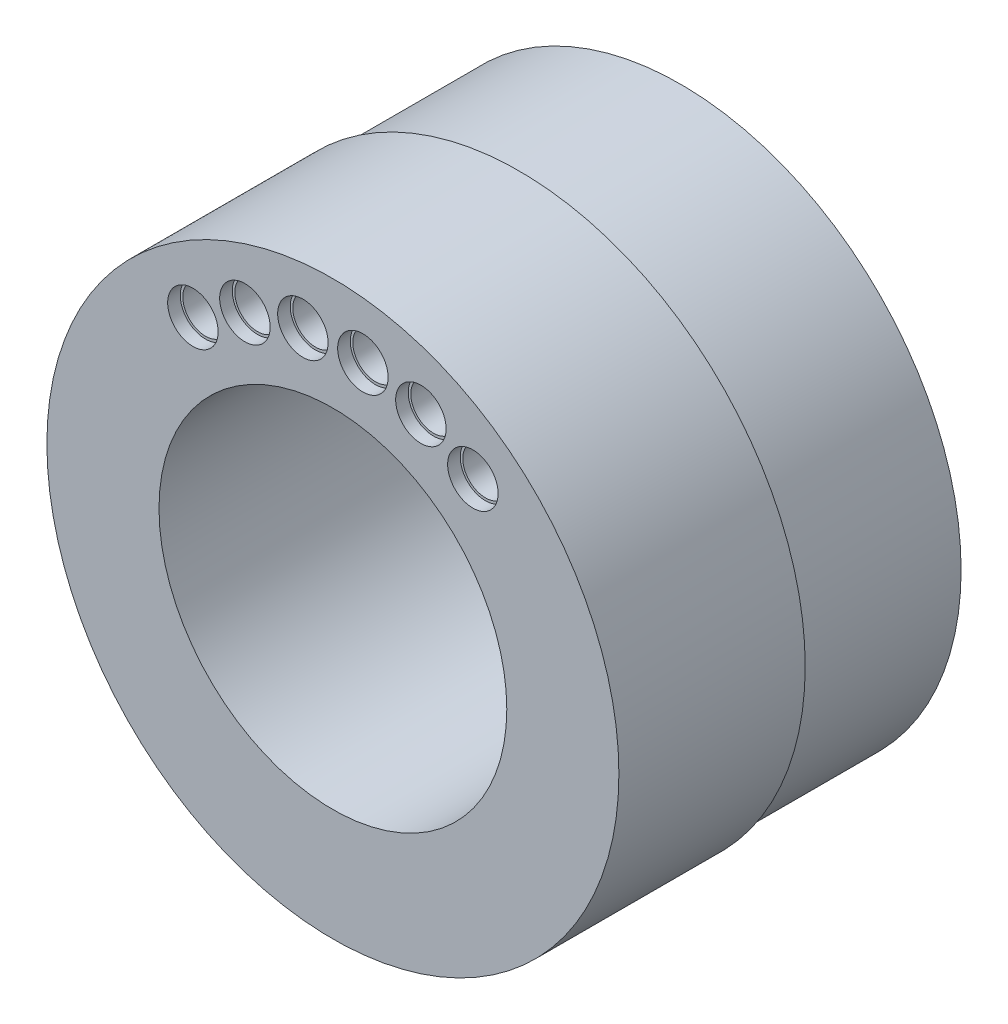
ISO-10303-21;
HEADER;
FILE_DESCRIPTION(('STEP AP214'),'2;1');
FILE_NAME('part.step','',(''),(''),'','','');
FILE_SCHEMA(('AUTOMOTIVE_DESIGN { 1 0 10303 214 1 1 1 1 }'));
ENDSEC;
DATA;
#1=APPLICATION_CONTEXT('core data for automotive mechanical design processes');
#2=APPLICATION_PROTOCOL_DEFINITION('international standard','automotive_design',2000,#1);
#3=PRODUCT_CONTEXT('',#1,'mechanical');
#4=PRODUCT('Part','Part','',(#3));
#5=PRODUCT_RELATED_PRODUCT_CATEGORY('part','',(#4));
#6=PRODUCT_DEFINITION_FORMATION('','',#4);
#7=PRODUCT_DEFINITION_CONTEXT('part definition',#1,'design');
#8=PRODUCT_DEFINITION('design','',#6,#7);
#9=PRODUCT_DEFINITION_SHAPE('','',#8);
#10=(LENGTH_UNIT() NAMED_UNIT(*) SI_UNIT(.MILLI.,.METRE.));
#11=(NAMED_UNIT(*) PLANE_ANGLE_UNIT() SI_UNIT($,.RADIAN.));
#12=(NAMED_UNIT(*) SI_UNIT($,.STERADIAN.) SOLID_ANGLE_UNIT());
#13=UNCERTAINTY_MEASURE_WITH_UNIT(LENGTH_MEASURE(1.E-05),#10,'distance_accuracy_value','');
#14=(GEOMETRIC_REPRESENTATION_CONTEXT(3) GLOBAL_UNCERTAINTY_ASSIGNED_CONTEXT((#13)) GLOBAL_UNIT_ASSIGNED_CONTEXT((#10,
#11,#12)) REPRESENTATION_CONTEXT('',''));
#15=CARTESIAN_POINT('',(0.,0.,0.));
#16=DIRECTION('',(0.,0.,1.));
#17=DIRECTION('',(1.,0.,0.));
#18=AXIS2_PLACEMENT_3D('',#15,#16,#17);
#19=CARTESIAN_POINT('',(23.025,0.,13.));
#20=DIRECTION('',(0.,0.,-1.));
#21=DIRECTION('',(-1.,0.,0.));
#22=AXIS2_PLACEMENT_3D('',#19,#20,#21);
#23=PLANE('',#22);
#24=CARTESIAN_POINT('',(0.,0.,13.));
#25=DIRECTION('',(0.,0.,1.));
#26=DIRECTION('',(1.,0.,0.));
#27=AXIS2_PLACEMENT_3D('',#24,#25,#26);
#28=CIRCLE('',#27,23.025);
#29=CARTESIAN_POINT('',(23.025,0.,13.));
#30=VERTEX_POINT('',#29);
#31=EDGE_CURVE('E11',#30,#30,#28,.T.);
#32=ORIENTED_EDGE('',*,*,#31,.F.);
#33=EDGE_LOOP('',(#32));
#34=FACE_BOUND('',#33,.T.);
#35=CARTESIAN_POINT('',(0.,0.,13.));
#36=DIRECTION('',(0.,0.,-1.));
#37=DIRECTION('',(-1.,0.,0.));
#38=AXIS2_PLACEMENT_3D('',#35,#36,#37);
#39=CIRCLE('',#38,22.575);
#40=CARTESIAN_POINT('',(22.575,0.,13.));
#41=VERTEX_POINT('',#40);
#42=EDGE_CURVE('E105',#41,#41,#39,.T.);
#43=ORIENTED_EDGE('',*,*,#42,.F.);
#44=EDGE_LOOP('',(#43));
#45=FACE_BOUND('',#44,.T.);
#46=ADVANCED_FACE('F35',(#34,#45),#23,.T.);
#47=CARTESIAN_POINT('',(0.,0.,13.));
#48=DIRECTION('',(0.,0.,1.));
#49=DIRECTION('',(1.,0.,0.));
#50=AXIS2_PLACEMENT_3D('',#47,#48,#49);
#51=CYLINDRICAL_SURFACE('',#50,23.025);
#52=ORIENTED_EDGE('',*,*,#31,.T.);
#53=EDGE_LOOP('',(#52));
#54=FACE_BOUND('',#53,.T.);
#55=CARTESIAN_POINT('',(0.,0.,28.));
#56=DIRECTION('',(0.,0.,1.));
#57=DIRECTION('',(1.,0.,0.));
#58=AXIS2_PLACEMENT_3D('',#55,#56,#57);
#59=CIRCLE('',#58,23.025);
#60=CARTESIAN_POINT('',(23.025,0.,28.));
#61=VERTEX_POINT('',#60);
#62=EDGE_CURVE('E44',#61,#61,#59,.T.);
#63=ORIENTED_EDGE('',*,*,#62,.F.);
#64=EDGE_LOOP('',(#63));
#65=FACE_BOUND('',#64,.T.);
#66=ADVANCED_FACE('F37',(#54,#65),#51,.T.);
#67=CARTESIAN_POINT('',(0.,0.,28.));
#68=DIRECTION('',(0.,0.,1.));
#69=DIRECTION('',(1.,0.,0.));
#70=AXIS2_PLACEMENT_3D('',#67,#68,#69);
#71=PLANE('',#70);
#72=CARTESIAN_POINT('',(11.2696959545239,14.6869537121415,28.));
#73=DIRECTION('',(0.,0.,1.));
#74=DIRECTION('',(1.,0.,0.));
#75=AXIS2_PLACEMENT_3D('',#72,#73,#74);
#76=CIRCLE('',#75,2.032);
#77=CARTESIAN_POINT('',(13.3016959545239,14.6869537121415,28.));
#78=VERTEX_POINT('',#77);
#79=EDGE_CURVE('E148',#78,#78,#76,.T.);
#80=ORIENTED_EDGE('',*,*,#79,.F.);
#81=EDGE_LOOP('',(#80));
#82=FACE_BOUND('',#81,.T.);
#83=CARTESIAN_POINT('',(7.08442704165876,17.1033198456152,28.));
#84=DIRECTION('',(0.,0.,1.));
#85=DIRECTION('',(1.,0.,0.));
#86=AXIS2_PLACEMENT_3D('',#83,#84,#85);
#87=CIRCLE('',#86,2.032);
#88=CARTESIAN_POINT('',(9.11642704165876,17.1033198456152,28.));
#89=VERTEX_POINT('',#88);
#90=EDGE_CURVE('E141',#89,#89,#87,.T.);
#91=ORIENTED_EDGE('',*,*,#90,.F.);
#92=EDGE_LOOP('',(#91));
#93=FACE_BOUND('',#92,.T.);
#94=CARTESIAN_POINT('',(2.41636613347372,18.3541229961827,28.));
#95=DIRECTION('',(0.,0.,1.));
#96=DIRECTION('',(1.,0.,0.));
#97=AXIS2_PLACEMENT_3D('',#94,#95,#96);
#98=CIRCLE('',#97,2.032);
#99=CARTESIAN_POINT('',(4.44836613347372,18.3541229961827,28.));
#100=VERTEX_POINT('',#99);
#101=EDGE_CURVE('E134',#100,#100,#98,.T.);
#102=ORIENTED_EDGE('',*,*,#101,.F.);
#103=EDGE_LOOP('',(#102));
#104=FACE_BOUND('',#103,.T.);
#105=CARTESIAN_POINT('',(-2.41636613347372,18.3541229961827,28.));
#106=DIRECTION('',(0.,0.,1.));
#107=DIRECTION('',(1.,0.,0.));
#108=AXIS2_PLACEMENT_3D('',#105,#106,#107);
#109=CIRCLE('',#108,2.032);
#110=CARTESIAN_POINT('',(-0.384366133473724,18.3541229961827,28.));
#111=VERTEX_POINT('',#110);
#112=EDGE_CURVE('E130',#111,#111,#109,.T.);
#113=ORIENTED_EDGE('',*,*,#112,.F.);
#114=EDGE_LOOP('',(#113));
#115=FACE_BOUND('',#114,.T.);
#116=CARTESIAN_POINT('',(-7.08442704165876,17.1033198456152,28.));
#117=DIRECTION('',(0.,0.,1.));
#118=DIRECTION('',(1.,0.,0.));
#119=AXIS2_PLACEMENT_3D('',#116,#117,#118);
#120=CIRCLE('',#119,2.032);
#121=CARTESIAN_POINT('',(-5.05242704165876,17.1033198456152,28.));
#122=VERTEX_POINT('',#121);
#123=EDGE_CURVE('E126',#122,#122,#120,.T.);
#124=ORIENTED_EDGE('',*,*,#123,.F.);
#125=EDGE_LOOP('',(#124));
#126=FACE_BOUND('',#125,.T.);
#127=CARTESIAN_POINT('',(-11.2696959545239,14.6869537121415,28.));
#128=DIRECTION('',(0.,0.,1.));
#129=DIRECTION('',(1.,0.,0.));
#130=AXIS2_PLACEMENT_3D('',#127,#128,#129);
#131=CIRCLE('',#130,2.032);
#132=CARTESIAN_POINT('',(-9.23769595452388,14.6869537121415,28.));
#133=VERTEX_POINT('',#132);
#134=EDGE_CURVE('E121',#133,#133,#131,.T.);
#135=ORIENTED_EDGE('',*,*,#134,.F.);
#136=EDGE_LOOP('',(#135));
#137=FACE_BOUND('',#136,.T.);
#138=CARTESIAN_POINT('',(0.,0.,28.));
#139=DIRECTION('',(0.,0.,1.));
#140=DIRECTION('',(1.,0.,0.));
#141=AXIS2_PLACEMENT_3D('',#138,#139,#140);
#142=CIRCLE('',#141,14.);
#143=CARTESIAN_POINT('',(14.,0.,28.));
#144=VERTEX_POINT('',#143);
#145=EDGE_CURVE('E93',#144,#144,#142,.T.);
#146=ORIENTED_EDGE('',*,*,#145,.F.);
#147=EDGE_LOOP('',(#146));
#148=FACE_BOUND('',#147,.T.);
#149=ORIENTED_EDGE('',*,*,#62,.T.);
#150=EDGE_LOOP('',(#149));
#151=FACE_BOUND('',#150,.T.);
#152=ADVANCED_FACE('F211',(#82,#93,#104,#115,#126,#137,#148,#151),#71,.T.);
#153=CARTESIAN_POINT('',(0.,0.,0.));
#154=DIRECTION('',(0.,0.,1.));
#155=DIRECTION('',(1.,0.,0.));
#156=AXIS2_PLACEMENT_3D('',#153,#154,#155);
#157=CYLINDRICAL_SURFACE('',#156,22.575);
#158=CARTESIAN_POINT('',(0.,0.,0.));
#159=DIRECTION('',(0.,0.,-1.));
#160=DIRECTION('',(-1.,0.,0.));
#161=AXIS2_PLACEMENT_3D('',#158,#159,#160);
#162=CIRCLE('',#161,22.575);
#163=CARTESIAN_POINT('',(22.575,0.,0.));
#164=VERTEX_POINT('',#163);
#165=EDGE_CURVE('E106',#164,#164,#162,.T.);
#166=CARTESIAN_POINT('',(22.575,0.,0.));
#167=CARTESIAN_POINT('',(22.575,0.,0.135416666666667));
#168=CARTESIAN_POINT('',(22.575,0.,0.270833333333333));
#169=CARTESIAN_POINT('',(22.575,0.,0.541666666666667));
#170=CARTESIAN_POINT('',(22.575,0.,0.677083333333334));
#171=CARTESIAN_POINT('',(22.575,0.,0.947916666666667));
#172=CARTESIAN_POINT('',(22.575,0.,1.08333333333333));
#173=CARTESIAN_POINT('',(22.575,0.,1.35416666666667));
#174=CARTESIAN_POINT('',(22.575,0.,1.48958333333333));
#175=CARTESIAN_POINT('',(22.575,0.,1.76041666666667));
#176=CARTESIAN_POINT('',(22.575,0.,1.89583333333333));
#177=CARTESIAN_POINT('',(22.575,0.,2.16666666666667));
#178=CARTESIAN_POINT('',(22.575,0.,2.30208333333333));
#179=CARTESIAN_POINT('',(22.575,0.,2.57291666666667));
#180=CARTESIAN_POINT('',(22.575,0.,2.70833333333333));
#181=CARTESIAN_POINT('',(22.575,0.,2.97916666666667));
#182=CARTESIAN_POINT('',(22.575,0.,3.11458333333333));
#183=CARTESIAN_POINT('',(22.575,0.,3.38541666666667));
#184=CARTESIAN_POINT('',(22.575,0.,3.52083333333333));
#185=CARTESIAN_POINT('',(22.575,0.,3.79166666666667));
#186=CARTESIAN_POINT('',(22.575,0.,3.92708333333334));
#187=CARTESIAN_POINT('',(22.575,0.,4.19791666666667));
#188=CARTESIAN_POINT('',(22.575,0.,4.33333333333334));
#189=CARTESIAN_POINT('',(22.575,0.,4.60416666666667));
#190=CARTESIAN_POINT('',(22.575,0.,4.73958333333333));
#191=CARTESIAN_POINT('',(22.575,0.,5.01041666666667));
#192=CARTESIAN_POINT('',(22.575,0.,5.14583333333334));
#193=CARTESIAN_POINT('',(22.575,0.,5.41666666666667));
#194=CARTESIAN_POINT('',(22.575,0.,5.55208333333334));
#195=CARTESIAN_POINT('',(22.575,0.,5.82291666666667));
#196=CARTESIAN_POINT('',(22.575,0.,5.95833333333334));
#197=CARTESIAN_POINT('',(22.575,0.,6.22916666666667));
#198=CARTESIAN_POINT('',(22.575,0.,6.36458333333334));
#199=CARTESIAN_POINT('',(22.575,0.,6.63541666666667));
#200=CARTESIAN_POINT('',(22.575,0.,6.77083333333334));
#201=CARTESIAN_POINT('',(22.575,0.,7.04166666666667));
#202=CARTESIAN_POINT('',(22.575,0.,7.17708333333334));
#203=CARTESIAN_POINT('',(22.575,0.,7.44791666666667));
#204=CARTESIAN_POINT('',(22.575,0.,7.58333333333334));
#205=CARTESIAN_POINT('',(22.575,0.,7.85416666666667));
#206=CARTESIAN_POINT('',(22.575,0.,7.98958333333334));
#207=CARTESIAN_POINT('',(22.575,0.,8.26041666666667));
#208=CARTESIAN_POINT('',(22.575,0.,8.39583333333334));
#209=CARTESIAN_POINT('',(22.575,0.,8.66666666666667));
#210=CARTESIAN_POINT('',(22.575,0.,8.80208333333334));
#211=CARTESIAN_POINT('',(22.575,0.,9.07291666666667));
#212=CARTESIAN_POINT('',(22.575,0.,9.20833333333334));
#213=CARTESIAN_POINT('',(22.575,0.,9.47916666666667));
#214=CARTESIAN_POINT('',(22.575,0.,9.61458333333334));
#215=CARTESIAN_POINT('',(22.575,0.,9.88541666666667));
#216=CARTESIAN_POINT('',(22.575,0.,10.0208333333333));
#217=CARTESIAN_POINT('',(22.575,0.,10.2916666666667));
#218=CARTESIAN_POINT('',(22.575,0.,10.4270833333333));
#219=CARTESIAN_POINT('',(22.575,0.,10.6979166666667));
#220=CARTESIAN_POINT('',(22.575,0.,10.8333333333333));
#221=CARTESIAN_POINT('',(22.575,0.,11.1041666666667));
#222=CARTESIAN_POINT('',(22.575,0.,11.2395833333333));
#223=CARTESIAN_POINT('',(22.575,0.,11.5104166666667));
#224=CARTESIAN_POINT('',(22.575,0.,11.6458333333333));
#225=CARTESIAN_POINT('',(22.575,0.,11.9166666666667));
#226=CARTESIAN_POINT('',(22.575,0.,12.0520833333333));
#227=CARTESIAN_POINT('',(22.575,0.,12.3229166666667));
#228=CARTESIAN_POINT('',(22.575,0.,12.4583333333333));
#229=CARTESIAN_POINT('',(22.575,0.,12.7291666666667));
#230=CARTESIAN_POINT('',(22.575,0.,12.8645833333333));
#231=CARTESIAN_POINT('',(22.575,0.,13.));
#232=B_SPLINE_CURVE_WITH_KNOTS('',3,(#166,#167,#168,#169,#170,#171,#172,#173,#174,#175,#176,
#177,#178,#179,#180,#181,#182,#183,#184,#185,#186,#187,#188,#189,#190,#191,#192,#193,#194,#195,
#196,#197,#198,#199,#200,#201,#202,#203,#204,#205,#206,#207,#208,#209,#210,#211,#212,#213,#214,
#215,#216,#217,#218,#219,#220,#221,#222,#223,#224,#225,#226,#227,#228,#229,#230,#231),
.UNSPECIFIED.,.F.,.F.,(4,2,2,2,2,2,2,2,2,2,2,2,2,2,2,2,2,2,2,2,2,2,2,2,2,2,2,2,2,2,2,2,4),(0.,
0.40625,0.8125,1.21875,1.625,2.03125,2.4375,2.84375,3.25,3.65625,4.0625,4.46875,4.875,5.28125,
5.6875,6.09375,6.5,6.90625,7.3125,7.71875,8.125,8.53125,8.93750000000001,9.34375000000001,9.75,
10.15625,10.5625,10.96875,11.375,11.78125,12.1875,12.59375,13.),.UNSPECIFIED.);
#233=EDGE_CURVE('BSEAM218',#164,#41,#232,.T.);
#234=ORIENTED_EDGE('',*,*,#165,.F.);
#235=ORIENTED_EDGE('',*,*,#42,.T.);
#236=ORIENTED_EDGE('',*,*,#233,.T.);
#237=ORIENTED_EDGE('',*,*,#233,.F.);
#238=EDGE_LOOP('',(#234,#236,#235,#237));
#239=FACE_BOUND('',#238,.T.);
#240=ADVANCED_FACE('F218',(#239),#157,.T.);
#241=CARTESIAN_POINT('',(0.,0.,0.));
#242=DIRECTION('',(0.,0.,-1.));
#243=DIRECTION('',(-1.,0.,0.));
#244=AXIS2_PLACEMENT_3D('',#241,#242,#243);
#245=PLANE('',#244);
#246=CARTESIAN_POINT('',(0.,17.5,0.));
#247=DIRECTION('',(0.,0.,-1.));
#248=DIRECTION('',(-1.,0.,0.));
#249=AXIS2_PLACEMENT_3D('',#246,#247,#248);
#250=CIRCLE('',#249,1.22949999999999);
#251=CARTESIAN_POINT('',(-1.22949999999999,17.5,0.));
#252=VERTEX_POINT('',#251);
#253=EDGE_CURVE('E69',#252,#252,#250,.T.);
#254=ORIENTED_EDGE('',*,*,#253,.F.);
#255=EDGE_LOOP('',(#254));
#256=FACE_BOUND('',#255,.T.);
#257=CARTESIAN_POINT('',(17.5,0.,0.));
#258=DIRECTION('',(0.,0.,-1.));
#259=DIRECTION('',(-1.,0.,0.));
#260=AXIS2_PLACEMENT_3D('',#257,#258,#259);
#261=CIRCLE('',#260,1.22949999999999);
#262=CARTESIAN_POINT('',(16.2705,0.,0.));
#263=VERTEX_POINT('',#262);
#264=EDGE_CURVE('E68',#263,#263,#261,.T.);
#265=ORIENTED_EDGE('',*,*,#264,.F.);
#266=EDGE_LOOP('',(#265));
#267=FACE_BOUND('',#266,.T.);
#268=CARTESIAN_POINT('',(0.,-17.5,0.));
#269=DIRECTION('',(0.,0.,-1.));
#270=DIRECTION('',(-1.,0.,0.));
#271=AXIS2_PLACEMENT_3D('',#268,#269,#270);
#272=CIRCLE('',#271,1.22949999999999);
#273=CARTESIAN_POINT('',(-1.22949999999999,-17.5,0.));
#274=VERTEX_POINT('',#273);
#275=EDGE_CURVE('E81',#274,#274,#272,.T.);
#276=ORIENTED_EDGE('',*,*,#275,.F.);
#277=EDGE_LOOP('',(#276));
#278=FACE_BOUND('',#277,.T.);
#279=CARTESIAN_POINT('',(-17.5,0.,0.));
#280=DIRECTION('',(0.,0.,-1.));
#281=DIRECTION('',(-1.,0.,0.));
#282=AXIS2_PLACEMENT_3D('',#279,#280,#281);
#283=CIRCLE('',#282,1.22949999999999);
#284=CARTESIAN_POINT('',(-18.7295,0.,0.));
#285=VERTEX_POINT('',#284);
#286=EDGE_CURVE('E87',#285,#285,#283,.T.);
#287=ORIENTED_EDGE('',*,*,#286,.F.);
#288=EDGE_LOOP('',(#287));
#289=FACE_BOUND('',#288,.T.);
#290=CARTESIAN_POINT('',(0.,0.,0.));
#291=DIRECTION('',(0.,0.,1.));
#292=DIRECTION('',(1.,0.,0.));
#293=AXIS2_PLACEMENT_3D('',#290,#291,#292);
#294=CIRCLE('',#293,10.);
#295=CARTESIAN_POINT('',(10.,0.,0.));
#296=VERTEX_POINT('',#295);
#297=EDGE_CURVE('E102',#296,#296,#294,.T.);
#298=ORIENTED_EDGE('',*,*,#297,.T.);
#299=EDGE_LOOP('',(#298));
#300=FACE_BOUND('',#299,.T.);
#301=ORIENTED_EDGE('',*,*,#165,.T.);
#302=EDGE_LOOP('',(#301));
#303=FACE_BOUND('',#302,.T.);
#304=ADVANCED_FACE('F222',(#256,#267,#278,#289,#300,#303),#245,.T.);
#305=CARTESIAN_POINT('',(0.,0.,28.));
#306=DIRECTION('',(0.,0.,1.));
#307=DIRECTION('',(1.,0.,0.));
#308=AXIS2_PLACEMENT_3D('',#305,#306,#307);
#309=CYLINDRICAL_SURFACE('',#308,10.);
#310=ORIENTED_EDGE('',*,*,#297,.F.);
#311=EDGE_LOOP('',(#310));
#312=FACE_BOUND('',#311,.T.);
#313=CARTESIAN_POINT('',(0.,0.,0.999999999999997));
#314=DIRECTION('',(0.,0.,1.));
#315=DIRECTION('',(1.,0.,0.));
#316=AXIS2_PLACEMENT_3D('',#313,#314,#315);
#317=CIRCLE('',#316,10.);
#318=CARTESIAN_POINT('',(10.,0.,0.999999999999997));
#319=VERTEX_POINT('',#318);
#320=EDGE_CURVE('E99',#319,#319,#317,.T.);
#321=ORIENTED_EDGE('',*,*,#320,.T.);
#322=EDGE_LOOP('',(#321));
#323=FACE_BOUND('',#322,.T.);
#324=ADVANCED_FACE('F226',(#312,#323),#309,.F.);
#325=CARTESIAN_POINT('',(10.,0.,0.999999999999999));
#326=DIRECTION('',(0.,0.,-1.));
#327=DIRECTION('',(-1.,0.,0.));
#328=AXIS2_PLACEMENT_3D('',#325,#326,#327);
#329=PLANE('',#328);
#330=ORIENTED_EDGE('',*,*,#320,.F.);
#331=EDGE_LOOP('',(#330));
#332=FACE_BOUND('',#331,.T.);
#333=CARTESIAN_POINT('',(0.,0.,1.));
#334=DIRECTION('',(0.,0.,1.));
#335=DIRECTION('',(1.,0.,0.));
#336=AXIS2_PLACEMENT_3D('',#333,#334,#335);
#337=CIRCLE('',#336,14.);
#338=CARTESIAN_POINT('',(14.,0.,1.));
#339=VERTEX_POINT('',#338);
#340=EDGE_CURVE('E96',#339,#339,#337,.T.);
#341=ORIENTED_EDGE('',*,*,#340,.T.);
#342=EDGE_LOOP('',(#341));
#343=FACE_BOUND('',#342,.T.);
#344=ADVANCED_FACE('F230',(#332,#343),#329,.F.);
#345=CARTESIAN_POINT('',(0.,0.,28.));
#346=DIRECTION('',(0.,0.,1.));
#347=DIRECTION('',(1.,0.,0.));
#348=AXIS2_PLACEMENT_3D('',#345,#346,#347);
#349=CYLINDRICAL_SURFACE('',#348,14.);
#350=ORIENTED_EDGE('',*,*,#340,.F.);
#351=EDGE_LOOP('',(#350));
#352=FACE_BOUND('',#351,.T.);
#353=ORIENTED_EDGE('',*,*,#145,.T.);
#354=EDGE_LOOP('',(#353));
#355=FACE_BOUND('',#354,.T.);
#356=ADVANCED_FACE('F234',(#352,#355),#349,.F.);
#357=CARTESIAN_POINT('',(-17.5,0.,14.9999999992766));
#358=DIRECTION('',(0.,0.,-1.));
#359=DIRECTION('',(-1.,0.,0.));
#360=AXIS2_PLACEMENT_3D('',#357,#358,#359);
#361=CONICAL_SURFACE('',#360,1.22949999999999,1.02974425749999);
#362=CARTESIAN_POINT('',(-17.5,0.,15.73875813234));
#363=VERTEX_POINT('',#362);
#364=VERTEX_LOOP('',#363);
#365=FACE_BOUND('',#364,.T.);
#366=CARTESIAN_POINT('',(-17.5,0.,14.9999999992766));
#367=DIRECTION('',(0.,0.,-1.));
#368=DIRECTION('',(-1.,0.,0.));
#369=AXIS2_PLACEMENT_3D('',#366,#367,#368);
#370=CIRCLE('',#369,1.22949999999999);
#371=CARTESIAN_POINT('',(-18.7295,0.,14.9999999992766));
#372=VERTEX_POINT('',#371);
#373=EDGE_CURVE('E90',#372,#372,#370,.T.);
#374=ORIENTED_EDGE('',*,*,#373,.T.);
#375=EDGE_LOOP('',(#374));
#376=FACE_BOUND('',#375,.T.);
#377=ADVANCED_FACE('F238',(#365,#376),#361,.F.);
#378=CARTESIAN_POINT('',(-17.5,0.,0.));
#379=DIRECTION('',(0.,0.,-1.));
#380=DIRECTION('',(-1.,0.,0.));
#381=AXIS2_PLACEMENT_3D('',#378,#379,#380);
#382=CYLINDRICAL_SURFACE('',#381,1.22949999999999);
#383=ORIENTED_EDGE('',*,*,#373,.F.);
#384=EDGE_LOOP('',(#383));
#385=FACE_BOUND('',#384,.T.);
#386=ORIENTED_EDGE('',*,*,#286,.T.);
#387=EDGE_LOOP('',(#386));
#388=FACE_BOUND('',#387,.T.);
#389=ADVANCED_FACE('F242',(#385,#388),#382,.F.);
#390=CARTESIAN_POINT('',(0.,-17.5,14.9999999992766));
#391=DIRECTION('',(0.,0.,-1.));
#392=DIRECTION('',(-1.,0.,0.));
#393=AXIS2_PLACEMENT_3D('',#390,#391,#392);
#394=CONICAL_SURFACE('',#393,1.22949999999999,1.02974425749999);
#395=CARTESIAN_POINT('',(0.,-17.5,15.73875813234));
#396=VERTEX_POINT('',#395);
#397=VERTEX_LOOP('',#396);
#398=FACE_BOUND('',#397,.T.);
#399=CARTESIAN_POINT('',(0.,-17.5,14.9999999992766));
#400=DIRECTION('',(0.,0.,-1.));
#401=DIRECTION('',(-1.,0.,0.));
#402=AXIS2_PLACEMENT_3D('',#399,#400,#401);
#403=CIRCLE('',#402,1.22949999999999);
#404=CARTESIAN_POINT('',(-1.22949999999999,-17.5,14.9999999992766));
#405=VERTEX_POINT('',#404);
#406=EDGE_CURVE('E84',#405,#405,#403,.T.);
#407=ORIENTED_EDGE('',*,*,#406,.T.);
#408=EDGE_LOOP('',(#407));
#409=FACE_BOUND('',#408,.T.);
#410=ADVANCED_FACE('F245',(#398,#409),#394,.F.);
#411=CARTESIAN_POINT('',(0.,-17.5,0.));
#412=DIRECTION('',(0.,0.,-1.));
#413=DIRECTION('',(-1.,0.,0.));
#414=AXIS2_PLACEMENT_3D('',#411,#412,#413);
#415=CYLINDRICAL_SURFACE('',#414,1.22949999999999);
#416=ORIENTED_EDGE('',*,*,#406,.F.);
#417=EDGE_LOOP('',(#416));
#418=FACE_BOUND('',#417,.T.);
#419=ORIENTED_EDGE('',*,*,#275,.T.);
#420=EDGE_LOOP('',(#419));
#421=FACE_BOUND('',#420,.T.);
#422=ADVANCED_FACE('F249',(#418,#421),#415,.F.);
#423=CARTESIAN_POINT('',(17.5,0.,14.9999999992766));
#424=DIRECTION('',(0.,0.,-1.));
#425=DIRECTION('',(-1.,0.,0.));
#426=AXIS2_PLACEMENT_3D('',#423,#424,#425);
#427=CONICAL_SURFACE('',#426,1.22949999999999,1.02974425749999);
#428=CARTESIAN_POINT('',(17.5,0.,15.73875813234));
#429=VERTEX_POINT('',#428);
#430=VERTEX_LOOP('',#429);
#431=FACE_BOUND('',#430,.T.);
#432=CARTESIAN_POINT('',(17.5,0.,14.9999999992766));
#433=DIRECTION('',(0.,0.,-1.));
#434=DIRECTION('',(-1.,0.,0.));
#435=AXIS2_PLACEMENT_3D('',#432,#433,#434);
#436=CIRCLE('',#435,1.22949999999999);
#437=CARTESIAN_POINT('',(16.2705,0.,14.9999999992766));
#438=VERTEX_POINT('',#437);
#439=EDGE_CURVE('E72',#438,#438,#436,.T.);
#440=ORIENTED_EDGE('',*,*,#439,.T.);
#441=EDGE_LOOP('',(#440));
#442=FACE_BOUND('',#441,.T.);
#443=ADVANCED_FACE('F252',(#431,#442),#427,.F.);
#444=CARTESIAN_POINT('',(17.5,0.,0.));
#445=DIRECTION('',(0.,0.,-1.));
#446=DIRECTION('',(-1.,0.,0.));
#447=AXIS2_PLACEMENT_3D('',#444,#445,#446);
#448=CYLINDRICAL_SURFACE('',#447,1.22949999999999);
#449=ORIENTED_EDGE('',*,*,#439,.F.);
#450=EDGE_LOOP('',(#449));
#451=FACE_BOUND('',#450,.T.);
#452=ORIENTED_EDGE('',*,*,#264,.T.);
#453=EDGE_LOOP('',(#452));
#454=FACE_BOUND('',#453,.T.);
#455=ADVANCED_FACE('F62',(#451,#454),#448,.F.);
#456=CARTESIAN_POINT('',(0.,17.5,14.9999999992766));
#457=DIRECTION('',(0.,0.,-1.));
#458=DIRECTION('',(-1.,0.,0.));
#459=AXIS2_PLACEMENT_3D('',#456,#457,#458);
#460=CONICAL_SURFACE('',#459,1.22949999999999,1.02974425749999);
#461=CARTESIAN_POINT('',(0.,17.5,15.73875813234));
#462=VERTEX_POINT('',#461);
#463=VERTEX_LOOP('',#462);
#464=FACE_BOUND('',#463,.T.);
#465=CARTESIAN_POINT('',(0.,17.5,14.9999999992766));
#466=DIRECTION('',(0.,0.,-1.));
#467=DIRECTION('',(-1.,0.,0.));
#468=AXIS2_PLACEMENT_3D('',#465,#466,#467);
#469=CIRCLE('',#468,1.22949999999999);
#470=CARTESIAN_POINT('',(-1.22949999999999,17.5,14.9999999992766));
#471=VERTEX_POINT('',#470);
#472=EDGE_CURVE('E66',#471,#471,#469,.T.);
#473=ORIENTED_EDGE('',*,*,#472,.T.);
#474=EDGE_LOOP('',(#473));
#475=FACE_BOUND('',#474,.T.);
#476=ADVANCED_FACE('F58',(#464,#475),#460,.F.);
#477=CARTESIAN_POINT('',(0.,17.5,0.));
#478=DIRECTION('',(0.,0.,-1.));
#479=DIRECTION('',(-1.,0.,0.));
#480=AXIS2_PLACEMENT_3D('',#477,#478,#479);
#481=CYLINDRICAL_SURFACE('',#480,1.22949999999999);
#482=ORIENTED_EDGE('',*,*,#472,.F.);
#483=EDGE_LOOP('',(#482));
#484=FACE_BOUND('',#483,.T.);
#485=ORIENTED_EDGE('',*,*,#253,.T.);
#486=EDGE_LOOP('',(#485));
#487=FACE_BOUND('',#486,.T.);
#488=ADVANCED_FACE('F61',(#484,#487),#481,.F.);
#489=CARTESIAN_POINT('',(-11.2696959545239,14.6869537121415,26.984));
#490=DIRECTION('',(0.,0.,1.));
#491=DIRECTION('',(1.,0.,0.));
#492=AXIS2_PLACEMENT_3D('',#489,#490,#491);
#493=PLANE('',#492);
#494=CARTESIAN_POINT('',(-11.2696959545239,14.6869537121415,26.984));
#495=DIRECTION('',(0.,0.,1.));
#496=DIRECTION('',(1.,0.,0.));
#497=AXIS2_PLACEMENT_3D('',#494,#495,#496);
#498=CIRCLE('',#497,2.032);
#499=CARTESIAN_POINT('',(-9.23769595452388,14.6869537121415,26.984));
#500=VERTEX_POINT('',#499);
#501=EDGE_CURVE('E117',#500,#500,#498,.T.);
#502=ORIENTED_EDGE('',*,*,#501,.T.);
#503=EDGE_LOOP('',(#502));
#504=FACE_BOUND('',#503,.T.);
#505=CARTESIAN_POINT('',(-11.2696959545239,14.6869537121415,26.984));
#506=DIRECTION('',(0.,0.,1.));
#507=DIRECTION('',(1.,0.,0.));
#508=AXIS2_PLACEMENT_3D('',#505,#506,#507);
#509=CIRCLE('',#508,1.8288);
#510=CARTESIAN_POINT('',(-9.44089595452388,14.6869537121415,26.984));
#511=VERTEX_POINT('',#510);
#512=EDGE_CURVE('E113',#511,#511,#509,.F.);
#513=ORIENTED_EDGE('',*,*,#512,.T.);
#514=EDGE_LOOP('',(#513));
#515=FACE_BOUND('',#514,.T.);
#516=ADVANCED_FACE('F261',(#504,#515),#493,.T.);
#517=CARTESIAN_POINT('',(-11.2696959545239,14.6869537121415,26.984));
#518=DIRECTION('',(0.,0.,1.));
#519=DIRECTION('',(1.,0.,0.));
#520=AXIS2_PLACEMENT_3D('',#517,#518,#519);
#521=CYLINDRICAL_SURFACE('',#520,2.032);
#522=ORIENTED_EDGE('',*,*,#501,.F.);
#523=EDGE_LOOP('',(#522));
#524=FACE_BOUND('',#523,.T.);
#525=ORIENTED_EDGE('',*,*,#134,.T.);
#526=EDGE_LOOP('',(#525));
#527=FACE_BOUND('',#526,.T.);
#528=ADVANCED_FACE('F277',(#524,#527),#521,.F.);
#529=CARTESIAN_POINT('',(-11.2696959545239,14.6869537121415,16.443));
#530=DIRECTION('',(0.,0.,1.));
#531=DIRECTION('',(1.,0.,0.));
#532=AXIS2_PLACEMENT_3D('',#529,#530,#531);
#533=PLANE('',#532);
#534=CARTESIAN_POINT('',(-11.2696959545239,14.6869537121415,16.443));
#535=DIRECTION('',(0.,0.,1.));
#536=DIRECTION('',(1.,0.,0.));
#537=AXIS2_PLACEMENT_3D('',#534,#535,#536);
#538=CIRCLE('',#537,1.8288);
#539=CARTESIAN_POINT('',(-9.44089595452388,14.6869537121415,16.443));
#540=VERTEX_POINT('',#539);
#541=EDGE_CURVE('E173',#540,#540,#538,.T.);
#542=ORIENTED_EDGE('',*,*,#541,.T.);
#543=EDGE_LOOP('',(#542));
#544=FACE_BOUND('',#543,.T.);
#545=ADVANCED_FACE('F273',(#544),#533,.T.);
#546=CARTESIAN_POINT('',(-11.2696959545239,14.6869537121415,16.443));
#547=DIRECTION('',(0.,0.,1.));
#548=DIRECTION('',(1.,0.,0.));
#549=AXIS2_PLACEMENT_3D('',#546,#547,#548);
#550=CYLINDRICAL_SURFACE('',#549,1.8288);
#551=ORIENTED_EDGE('',*,*,#541,.F.);
#552=EDGE_LOOP('',(#551));
#553=FACE_BOUND('',#552,.T.);
#554=ORIENTED_EDGE('',*,*,#512,.F.);
#555=EDGE_LOOP('',(#554));
#556=FACE_BOUND('',#555,.T.);
#557=ADVANCED_FACE('F269',(#553,#556),#550,.F.);
#558=CARTESIAN_POINT('',(-7.08442704165876,17.1033198456152,26.984));
#559=DIRECTION('',(0.,0.,1.));
#560=DIRECTION('',(1.,0.,0.));
#561=AXIS2_PLACEMENT_3D('',#558,#559,#560);
#562=PLANE('',#561);
#563=CARTESIAN_POINT('',(-7.08442704165876,17.1033198456152,26.984));
#564=DIRECTION('',(0.,0.,1.));
#565=DIRECTION('',(1.,0.,0.));
#566=AXIS2_PLACEMENT_3D('',#563,#564,#565);
#567=CIRCLE('',#566,2.032);
#568=CARTESIAN_POINT('',(-5.05242704165876,17.1033198456152,26.984));
#569=VERTEX_POINT('',#568);
#570=EDGE_CURVE('E122',#569,#569,#567,.T.);
#571=ORIENTED_EDGE('',*,*,#570,.T.);
#572=EDGE_LOOP('',(#571));
#573=FACE_BOUND('',#572,.T.);
#574=CARTESIAN_POINT('',(-7.08442704165876,17.1033198456152,26.984));
#575=DIRECTION('',(0.,0.,1.));
#576=DIRECTION('',(1.,0.,0.));
#577=AXIS2_PLACEMENT_3D('',#574,#575,#576);
#578=CIRCLE('',#577,1.8288);
#579=CARTESIAN_POINT('',(-5.25562704165876,17.1033198456152,26.984));
#580=VERTEX_POINT('',#579);
#581=EDGE_CURVE('E118',#580,#580,#578,.F.);
#582=ORIENTED_EDGE('',*,*,#581,.T.);
#583=EDGE_LOOP('',(#582));
#584=FACE_BOUND('',#583,.T.);
#585=ADVANCED_FACE('F272',(#573,#584),#562,.T.);
#586=CARTESIAN_POINT('',(-7.08442704165876,17.1033198456152,26.984));
#587=DIRECTION('',(0.,0.,1.));
#588=DIRECTION('',(1.,0.,0.));
#589=AXIS2_PLACEMENT_3D('',#586,#587,#588);
#590=CYLINDRICAL_SURFACE('',#589,2.032);
#591=ORIENTED_EDGE('',*,*,#570,.F.);
#592=EDGE_LOOP('',(#591));
#593=FACE_BOUND('',#592,.T.);
#594=ORIENTED_EDGE('',*,*,#123,.T.);
#595=EDGE_LOOP('',(#594));
#596=FACE_BOUND('',#595,.T.);
#597=ADVANCED_FACE('F267',(#593,#596),#590,.F.);
#598=CARTESIAN_POINT('',(-7.08442704165876,17.1033198456152,16.443));
#599=DIRECTION('',(0.,0.,1.));
#600=DIRECTION('',(1.,0.,0.));
#601=AXIS2_PLACEMENT_3D('',#598,#599,#600);
#602=PLANE('',#601);
#603=CARTESIAN_POINT('',(-7.08442704165876,17.1033198456152,16.443));
#604=DIRECTION('',(0.,0.,1.));
#605=DIRECTION('',(1.,0.,0.));
#606=AXIS2_PLACEMENT_3D('',#603,#604,#605);
#607=CIRCLE('',#606,1.8288);
#608=CARTESIAN_POINT('',(-5.25562704165876,17.1033198456152,16.443));
#609=VERTEX_POINT('',#608);
#610=EDGE_CURVE('E176',#609,#609,#607,.T.);
#611=ORIENTED_EDGE('',*,*,#610,.T.);
#612=EDGE_LOOP('',(#611));
#613=FACE_BOUND('',#612,.T.);
#614=ADVANCED_FACE('F202',(#613),#602,.T.);
#615=CARTESIAN_POINT('',(-7.08442704165876,17.1033198456152,16.443));
#616=DIRECTION('',(0.,0.,1.));
#617=DIRECTION('',(1.,0.,0.));
#618=AXIS2_PLACEMENT_3D('',#615,#616,#617);
#619=CYLINDRICAL_SURFACE('',#618,1.8288);
#620=ORIENTED_EDGE('',*,*,#610,.F.);
#621=EDGE_LOOP('',(#620));
#622=FACE_BOUND('',#621,.T.);
#623=ORIENTED_EDGE('',*,*,#581,.F.);
#624=EDGE_LOOP('',(#623));
#625=FACE_BOUND('',#624,.T.);
#626=ADVANCED_FACE('F193',(#622,#625),#619,.F.);
#627=CARTESIAN_POINT('',(-2.41636613347372,18.3541229961827,26.984));
#628=DIRECTION('',(0.,0.,1.));
#629=DIRECTION('',(1.,0.,0.));
#630=AXIS2_PLACEMENT_3D('',#627,#628,#629);
#631=PLANE('',#630);
#632=CARTESIAN_POINT('',(-2.41636613347372,18.3541229961827,26.984));
#633=DIRECTION('',(0.,0.,1.));
#634=DIRECTION('',(1.,0.,0.));
#635=AXIS2_PLACEMENT_3D('',#632,#633,#634);
#636=CIRCLE('',#635,2.032);
#637=CARTESIAN_POINT('',(-0.384366133473724,18.3541229961827,26.984));
#638=VERTEX_POINT('',#637);
#639=EDGE_CURVE('E127',#638,#638,#636,.T.);
#640=ORIENTED_EDGE('',*,*,#639,.T.);
#641=EDGE_LOOP('',(#640));
#642=FACE_BOUND('',#641,.T.);
#643=CARTESIAN_POINT('',(-2.41636613347372,18.3541229961827,26.984));
#644=DIRECTION('',(0.,0.,1.));
#645=DIRECTION('',(1.,0.,0.));
#646=AXIS2_PLACEMENT_3D('',#643,#644,#645);
#647=CIRCLE('',#646,1.8288);
#648=CARTESIAN_POINT('',(-0.587566133473723,18.3541229961827,26.984));
#649=VERTEX_POINT('',#648);
#650=EDGE_CURVE('E123',#649,#649,#647,.F.);
#651=ORIENTED_EDGE('',*,*,#650,.T.);
#652=EDGE_LOOP('',(#651));
#653=FACE_BOUND('',#652,.T.);
#654=ADVANCED_FACE('F190',(#642,#653),#631,.T.);
#655=CARTESIAN_POINT('',(-2.41636613347372,18.3541229961827,26.984));
#656=DIRECTION('',(0.,0.,1.));
#657=DIRECTION('',(1.,0.,0.));
#658=AXIS2_PLACEMENT_3D('',#655,#656,#657);
#659=CYLINDRICAL_SURFACE('',#658,2.032);
#660=ORIENTED_EDGE('',*,*,#639,.F.);
#661=EDGE_LOOP('',(#660));
#662=FACE_BOUND('',#661,.T.);
#663=ORIENTED_EDGE('',*,*,#112,.T.);
#664=EDGE_LOOP('',(#663));
#665=FACE_BOUND('',#664,.T.);
#666=ADVANCED_FACE('F192',(#662,#665),#659,.F.);
#667=CARTESIAN_POINT('',(-2.41636613347372,18.3541229961827,16.443));
#668=DIRECTION('',(0.,0.,1.));
#669=DIRECTION('',(1.,0.,0.));
#670=AXIS2_PLACEMENT_3D('',#667,#668,#669);
#671=PLANE('',#670);
#672=CARTESIAN_POINT('',(-2.41636613347372,18.3541229961827,16.443));
#673=DIRECTION('',(0.,0.,1.));
#674=DIRECTION('',(1.,0.,0.));
#675=AXIS2_PLACEMENT_3D('',#672,#673,#674);
#676=CIRCLE('',#675,1.8288);
#677=CARTESIAN_POINT('',(-0.587566133473723,18.3541229961827,16.443));
#678=VERTEX_POINT('',#677);
#679=EDGE_CURVE('E75',#678,#678,#676,.T.);
#680=ORIENTED_EDGE('',*,*,#679,.T.);
#681=EDGE_LOOP('',(#680));
#682=FACE_BOUND('',#681,.T.);
#683=ADVANCED_FACE('F181',(#682),#671,.T.);
#684=CARTESIAN_POINT('',(-2.41636613347372,18.3541229961827,16.443));
#685=DIRECTION('',(0.,0.,1.));
#686=DIRECTION('',(1.,0.,0.));
#687=AXIS2_PLACEMENT_3D('',#684,#685,#686);
#688=CYLINDRICAL_SURFACE('',#687,1.8288);
#689=ORIENTED_EDGE('',*,*,#679,.F.);
#690=EDGE_LOOP('',(#689));
#691=FACE_BOUND('',#690,.T.);
#692=ORIENTED_EDGE('',*,*,#650,.F.);
#693=EDGE_LOOP('',(#692));
#694=FACE_BOUND('',#693,.T.);
#695=ADVANCED_FACE('F183',(#691,#694),#688,.F.);
#696=CARTESIAN_POINT('',(2.41636613347372,18.3541229961827,26.984));
#697=DIRECTION('',(0.,0.,1.));
#698=DIRECTION('',(1.,0.,0.));
#699=AXIS2_PLACEMENT_3D('',#696,#697,#698);
#700=PLANE('',#699);
#701=CARTESIAN_POINT('',(2.41636613347372,18.3541229961827,26.984));
#702=DIRECTION('',(0.,0.,1.));
#703=DIRECTION('',(1.,0.,0.));
#704=AXIS2_PLACEMENT_3D('',#701,#702,#703);
#705=CIRCLE('',#704,2.032);
#706=CARTESIAN_POINT('',(4.44836613347372,18.3541229961827,26.984));
#707=VERTEX_POINT('',#706);
#708=EDGE_CURVE('E131',#707,#707,#705,.T.);
#709=ORIENTED_EDGE('',*,*,#708,.T.);
#710=EDGE_LOOP('',(#709));
#711=FACE_BOUND('',#710,.T.);
#712=CARTESIAN_POINT('',(2.41636613347372,18.3541229961827,26.984));
#713=DIRECTION('',(0.,0.,1.));
#714=DIRECTION('',(1.,0.,0.));
#715=AXIS2_PLACEMENT_3D('',#712,#713,#714);
#716=CIRCLE('',#715,1.8288);
#717=CARTESIAN_POINT('',(4.24516613347372,18.3541229961827,26.984));
#718=VERTEX_POINT('',#717);
#719=EDGE_CURVE('E128',#718,#718,#716,.F.);
#720=ORIENTED_EDGE('',*,*,#719,.T.);
#721=EDGE_LOOP('',(#720));
#722=FACE_BOUND('',#721,.T.);
#723=ADVANCED_FACE('F186',(#711,#722),#700,.T.);
#724=CARTESIAN_POINT('',(2.41636613347372,18.3541229961827,26.984));
#725=DIRECTION('',(0.,0.,1.));
#726=DIRECTION('',(1.,0.,0.));
#727=AXIS2_PLACEMENT_3D('',#724,#725,#726);
#728=CYLINDRICAL_SURFACE('',#727,2.032);
#729=ORIENTED_EDGE('',*,*,#708,.F.);
#730=EDGE_LOOP('',(#729));
#731=FACE_BOUND('',#730,.T.);
#732=ORIENTED_EDGE('',*,*,#101,.T.);
#733=EDGE_LOOP('',(#732));
#734=FACE_BOUND('',#733,.T.);
#735=ADVANCED_FACE('F306',(#731,#734),#728,.F.);
#736=CARTESIAN_POINT('',(2.41636613347372,18.3541229961827,16.443));
#737=DIRECTION('',(0.,0.,-1.));
#738=DIRECTION('',(-1.,0.,0.));
#739=AXIS2_PLACEMENT_3D('',#736,#737,#738);
#740=PLANE('',#739);
#741=CARTESIAN_POINT('',(2.41636613347372,18.3541229961827,16.443));
#742=DIRECTION('',(0.,0.,1.));
#743=DIRECTION('',(-1.,0.,0.));
#744=AXIS2_PLACEMENT_3D('',#741,#742,#743);
#745=CIRCLE('',#744,1.8288);
#746=CARTESIAN_POINT('',(0.587566133473723,18.3541229961827,16.443));
#747=VERTEX_POINT('',#746);
#748=EDGE_CURVE('E116',#747,#747,#745,.T.);
#749=ORIENTED_EDGE('',*,*,#748,.T.);
#750=EDGE_LOOP('',(#749));
#751=FACE_BOUND('',#750,.T.);
#752=ADVANCED_FACE('F302',(#751),#740,.F.);
#753=CARTESIAN_POINT('',(2.41636613347372,18.3541229961827,16.443));
#754=DIRECTION('',(0.,0.,1.));
#755=DIRECTION('',(1.,0.,0.));
#756=AXIS2_PLACEMENT_3D('',#753,#754,#755);
#757=CYLINDRICAL_SURFACE('',#756,1.8288);
#758=ORIENTED_EDGE('',*,*,#748,.F.);
#759=EDGE_LOOP('',(#758));
#760=FACE_BOUND('',#759,.T.);
#761=ORIENTED_EDGE('',*,*,#719,.F.);
#762=EDGE_LOOP('',(#761));
#763=FACE_BOUND('',#762,.T.);
#764=ADVANCED_FACE('F298',(#760,#763),#757,.F.);
#765=CARTESIAN_POINT('',(7.08442704165876,17.1033198456152,26.984));
#766=DIRECTION('',(0.,0.,1.));
#767=DIRECTION('',(1.,0.,0.));
#768=AXIS2_PLACEMENT_3D('',#765,#766,#767);
#769=PLANE('',#768);
#770=CARTESIAN_POINT('',(7.08442704165876,17.1033198456152,26.984));
#771=DIRECTION('',(0.,0.,1.));
#772=DIRECTION('',(1.,0.,0.));
#773=AXIS2_PLACEMENT_3D('',#770,#771,#772);
#774=CIRCLE('',#773,2.032);
#775=CARTESIAN_POINT('',(9.11642704165876,17.1033198456152,26.984));
#776=VERTEX_POINT('',#775);
#777=EDGE_CURVE('E135',#776,#776,#774,.T.);
#778=ORIENTED_EDGE('',*,*,#777,.T.);
#779=EDGE_LOOP('',(#778));
#780=FACE_BOUND('',#779,.T.);
#781=CARTESIAN_POINT('',(7.08442704165876,17.1033198456152,26.984));
#782=DIRECTION('',(0.,0.,1.));
#783=DIRECTION('',(1.,0.,0.));
#784=AXIS2_PLACEMENT_3D('',#781,#782,#783);
#785=CIRCLE('',#784,1.8288);
#786=CARTESIAN_POINT('',(8.91322704165876,17.1033198456152,26.984));
#787=VERTEX_POINT('',#786);
#788=EDGE_CURVE('E132',#787,#787,#785,.F.);
#789=ORIENTED_EDGE('',*,*,#788,.T.);
#790=EDGE_LOOP('',(#789));
#791=FACE_BOUND('',#790,.T.);
#792=ADVANCED_FACE('F301',(#780,#791),#769,.T.);
#793=CARTESIAN_POINT('',(7.08442704165876,17.1033198456152,26.984));
#794=DIRECTION('',(0.,0.,1.));
#795=DIRECTION('',(1.,0.,0.));
#796=AXIS2_PLACEMENT_3D('',#793,#794,#795);
#797=CYLINDRICAL_SURFACE('',#796,2.032);
#798=ORIENTED_EDGE('',*,*,#777,.F.);
#799=EDGE_LOOP('',(#798));
#800=FACE_BOUND('',#799,.T.);
#801=ORIENTED_EDGE('',*,*,#90,.T.);
#802=EDGE_LOOP('',(#801));
#803=FACE_BOUND('',#802,.T.);
#804=ADVANCED_FACE('F296',(#800,#803),#797,.F.);
#805=CARTESIAN_POINT('',(7.08442704165876,17.1033198456152,16.443));
#806=DIRECTION('',(0.,0.,-1.));
#807=DIRECTION('',(-1.,0.,0.));
#808=AXIS2_PLACEMENT_3D('',#805,#806,#807);
#809=PLANE('',#808);
#810=CARTESIAN_POINT('',(7.08442704165876,17.1033198456152,16.443));
#811=DIRECTION('',(0.,0.,1.));
#812=DIRECTION('',(-1.,0.,0.));
#813=AXIS2_PLACEMENT_3D('',#810,#811,#812);
#814=CIRCLE('',#813,1.8288);
#815=CARTESIAN_POINT('',(5.25562704165876,17.1033198456152,16.443));
#816=VERTEX_POINT('',#815);
#817=EDGE_CURVE('E167',#816,#816,#814,.T.);
#818=ORIENTED_EDGE('',*,*,#817,.T.);
#819=EDGE_LOOP('',(#818));
#820=FACE_BOUND('',#819,.T.);
#821=ADVANCED_FACE('F292',(#820),#809,.F.);
#822=CARTESIAN_POINT('',(7.08442704165876,17.1033198456152,16.443));
#823=DIRECTION('',(0.,0.,1.));
#824=DIRECTION('',(1.,0.,0.));
#825=AXIS2_PLACEMENT_3D('',#822,#823,#824);
#826=CYLINDRICAL_SURFACE('',#825,1.8288);
#827=ORIENTED_EDGE('',*,*,#817,.F.);
#828=EDGE_LOOP('',(#827));
#829=FACE_BOUND('',#828,.T.);
#830=ORIENTED_EDGE('',*,*,#788,.F.);
#831=EDGE_LOOP('',(#830));
#832=FACE_BOUND('',#831,.T.);
#833=ADVANCED_FACE('F288',(#829,#832),#826,.F.);
#834=CARTESIAN_POINT('',(11.2696959545239,14.6869537121415,26.984));
#835=DIRECTION('',(0.,0.,1.));
#836=DIRECTION('',(1.,0.,0.));
#837=AXIS2_PLACEMENT_3D('',#834,#835,#836);
#838=PLANE('',#837);
#839=CARTESIAN_POINT('',(11.2696959545239,14.6869537121415,26.984));
#840=DIRECTION('',(0.,0.,1.));
#841=DIRECTION('',(1.,0.,0.));
#842=AXIS2_PLACEMENT_3D('',#839,#840,#841);
#843=CIRCLE('',#842,2.032);
#844=CARTESIAN_POINT('',(13.3016959545239,14.6869537121415,26.984));
#845=VERTEX_POINT('',#844);
#846=EDGE_CURVE('E590',#845,#845,#843,.T.);
#847=ORIENTED_EDGE('',*,*,#846,.T.);
#848=EDGE_LOOP('',(#847));
#849=FACE_BOUND('',#848,.T.);
#850=CARTESIAN_POINT('',(11.2696959545239,14.6869537121415,26.984));
#851=DIRECTION('',(0.,0.,1.));
#852=DIRECTION('',(1.,0.,0.));
#853=AXIS2_PLACEMENT_3D('',#850,#851,#852);
#854=CIRCLE('',#853,1.8288);
#855=CARTESIAN_POINT('',(13.0984959545239,14.6869537121415,26.984));
#856=VERTEX_POINT('',#855);
#857=EDGE_CURVE('E39',#856,#856,#854,.F.);
#858=ORIENTED_EDGE('',*,*,#857,.T.);
#859=EDGE_LOOP('',(#858));
#860=FACE_BOUND('',#859,.T.);
#861=ADVANCED_FACE('F291',(#849,#860),#838,.T.);
#862=CARTESIAN_POINT('',(11.2696959545239,14.6869537121415,26.984));
#863=DIRECTION('',(0.,0.,1.));
#864=DIRECTION('',(1.,0.,0.));
#865=AXIS2_PLACEMENT_3D('',#862,#863,#864);
#866=CYLINDRICAL_SURFACE('',#865,2.032);
#867=ORIENTED_EDGE('',*,*,#846,.F.);
#868=EDGE_LOOP('',(#867));
#869=FACE_BOUND('',#868,.T.);
#870=ORIENTED_EDGE('',*,*,#79,.T.);
#871=EDGE_LOOP('',(#870));
#872=FACE_BOUND('',#871,.T.);
#873=ADVANCED_FACE('F286',(#869,#872),#866,.F.);
#874=CARTESIAN_POINT('',(11.2696959545239,14.6869537121415,16.443));
#875=DIRECTION('',(0.,0.,-1.));
#876=DIRECTION('',(-1.,0.,0.));
#877=AXIS2_PLACEMENT_3D('',#874,#875,#876);
#878=PLANE('',#877);
#879=CARTESIAN_POINT('',(11.2696959545239,14.6869537121415,16.443));
#880=DIRECTION('',(0.,0.,1.));
#881=DIRECTION('',(-1.,0.,0.));
#882=AXIS2_PLACEMENT_3D('',#879,#880,#881);
#883=CIRCLE('',#882,1.8288);
#884=CARTESIAN_POINT('',(9.44089595452388,14.6869537121415,16.443));
#885=VERTEX_POINT('',#884);
#886=EDGE_CURVE('E170',#885,#885,#883,.T.);
#887=ORIENTED_EDGE('',*,*,#886,.T.);
#888=EDGE_LOOP('',(#887));
#889=FACE_BOUND('',#888,.T.);
#890=ADVANCED_FACE('F282',(#889),#878,.F.);
#891=CARTESIAN_POINT('',(11.2696959545239,14.6869537121415,16.443));
#892=DIRECTION('',(0.,0.,1.));
#893=DIRECTION('',(1.,0.,0.));
#894=AXIS2_PLACEMENT_3D('',#891,#892,#893);
#895=CYLINDRICAL_SURFACE('',#894,1.8288);
#896=ORIENTED_EDGE('',*,*,#886,.F.);
#897=EDGE_LOOP('',(#896));
#898=FACE_BOUND('',#897,.T.);
#899=ORIENTED_EDGE('',*,*,#857,.F.);
#900=EDGE_LOOP('',(#899));
#901=FACE_BOUND('',#900,.T.);
#902=ADVANCED_FACE('F279',(#898,#901),#895,.F.);
#903=CLOSED_SHELL('',(#46,#66,#152,#240,#304,#324,#344,#356,#377,#389,#410,#422,#443,#455,#476,
#488,#516,#528,#545,#557,#585,#597,#614,#626,#654,#666,#683,#695,#723,#735,#752,#764,#792,#804,
#821,#833,#861,#873,#890,#902));
#904=MANIFOLD_SOLID_BREP('B2',#903);
#905=ADVANCED_BREP_SHAPE_REPRESENTATION('',(#18,#904),#14);
#906=SHAPE_DEFINITION_REPRESENTATION(#9,#905);
ENDSEC;
END-ISO-10303-21;
